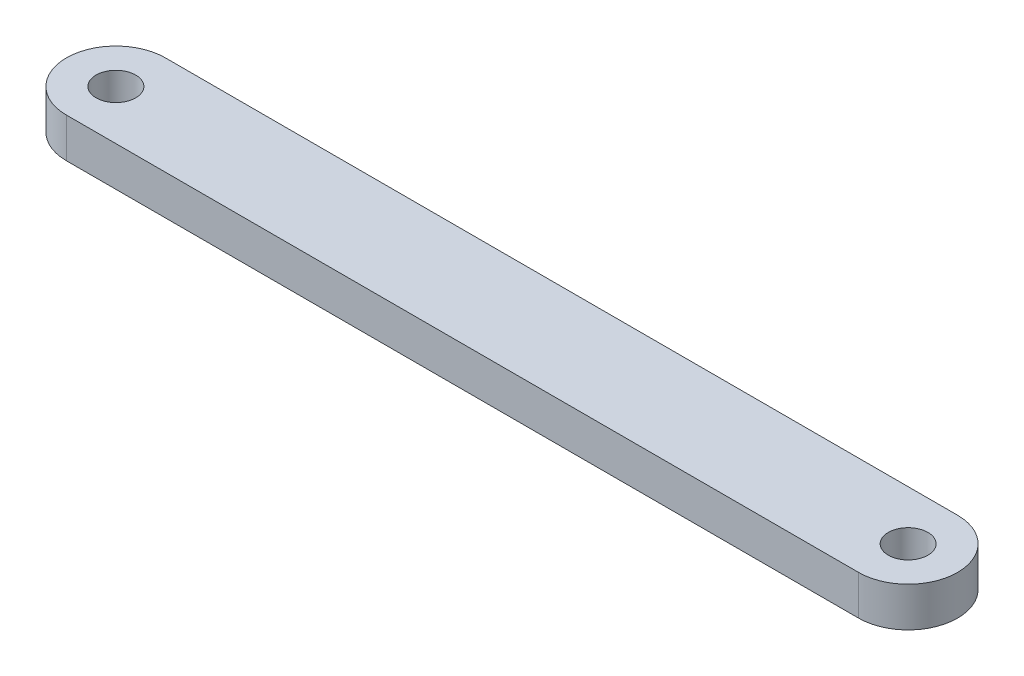
ISO-10303-21;
HEADER;
FILE_DESCRIPTION(('STEP AP214'),'2;1');
FILE_NAME('part.step','',(''),(''),'','','');
FILE_SCHEMA(('AUTOMOTIVE_DESIGN { 1 0 10303 214 1 1 1 1 }'));
ENDSEC;
DATA;
#1=APPLICATION_CONTEXT('core data for automotive mechanical design processes');
#2=APPLICATION_PROTOCOL_DEFINITION('international standard','automotive_design',2000,#1);
#3=PRODUCT_CONTEXT('',#1,'mechanical');
#4=PRODUCT('Part','Part','',(#3));
#5=PRODUCT_RELATED_PRODUCT_CATEGORY('part','',(#4));
#6=PRODUCT_DEFINITION_FORMATION('','',#4);
#7=PRODUCT_DEFINITION_CONTEXT('part definition',#1,'design');
#8=PRODUCT_DEFINITION('design','',#6,#7);
#9=PRODUCT_DEFINITION_SHAPE('','',#8);
#10=(LENGTH_UNIT() NAMED_UNIT(*) SI_UNIT(.MILLI.,.METRE.));
#11=(NAMED_UNIT(*) PLANE_ANGLE_UNIT() SI_UNIT($,.RADIAN.));
#12=(NAMED_UNIT(*) SI_UNIT($,.STERADIAN.) SOLID_ANGLE_UNIT());
#13=UNCERTAINTY_MEASURE_WITH_UNIT(LENGTH_MEASURE(1.E-05),#10,'distance_accuracy_value','');
#14=(GEOMETRIC_REPRESENTATION_CONTEXT(3) GLOBAL_UNCERTAINTY_ASSIGNED_CONTEXT((#13)) GLOBAL_UNIT_ASSIGNED_CONTEXT((#10,
#11,#12)) REPRESENTATION_CONTEXT('',''));
#15=CARTESIAN_POINT('',(0.,0.,0.));
#16=DIRECTION('',(0.,0.,1.));
#17=DIRECTION('',(1.,0.,0.));
#18=AXIS2_PLACEMENT_3D('',#15,#16,#17);
#19=CARTESIAN_POINT('',(-10.,2.,0.));
#20=DIRECTION('',(0.,1.,0.));
#21=DIRECTION('',(0.,0.,1.));
#22=AXIS2_PLACEMENT_3D('',#19,#20,#21);
#23=PLANE('',#22);
#24=CARTESIAN_POINT('',(30.,2.,0.));
#25=DIRECTION('',(0.,1.,0.));
#26=DIRECTION('',(0.,0.,1.));
#27=AXIS2_PLACEMENT_3D('',#24,#25,#26);
#28=CIRCLE('',#27,0.999999999999998);
#29=CARTESIAN_POINT('',(30.,2.,0.999999999999998));
#30=VERTEX_POINT('',#29);
#31=EDGE_CURVE('E104',#30,#30,#28,.T.);
#32=ORIENTED_EDGE('',*,*,#31,.F.);
#33=EDGE_LOOP('',(#32));
#34=FACE_BOUND('',#33,.T.);
#35=CARTESIAN_POINT('',(-10.,2.,0.));
#36=DIRECTION('',(0.,1.,0.));
#37=DIRECTION('',(0.,0.,1.));
#38=AXIS2_PLACEMENT_3D('',#35,#36,#37);
#39=CIRCLE('',#38,2.5);
#40=CARTESIAN_POINT('',(-10.,2.,-2.5));
#41=VERTEX_POINT('',#40);
#42=CARTESIAN_POINT('',(-10.,2.,2.5));
#43=VERTEX_POINT('',#42);
#44=EDGE_CURVE('E89',#41,#43,#39,.T.);
#45=ORIENTED_EDGE('',*,*,#44,.T.);
#46=DIRECTION('',(1.,0.,0.));
#47=VECTOR('',#46,1.);
#48=CARTESIAN_POINT('',(-10.,2.,2.5));
#49=LINE('',#48,#47);
#50=CARTESIAN_POINT('',(30.,2.,2.5));
#51=VERTEX_POINT('',#50);
#52=EDGE_CURVE('E84',#43,#51,#49,.T.);
#53=ORIENTED_EDGE('',*,*,#52,.T.);
#54=CARTESIAN_POINT('',(30.,2.,0.));
#55=DIRECTION('',(0.,1.,0.));
#56=DIRECTION('',(0.,0.,1.));
#57=AXIS2_PLACEMENT_3D('',#54,#55,#56);
#58=CIRCLE('',#57,2.5);
#59=CARTESIAN_POINT('',(30.,2.,-2.5));
#60=VERTEX_POINT('',#59);
#61=EDGE_CURVE('E87',#51,#60,#58,.T.);
#62=ORIENTED_EDGE('',*,*,#61,.T.);
#63=DIRECTION('',(-1.,0.,0.));
#64=VECTOR('',#63,1.);
#65=CARTESIAN_POINT('',(-10.,2.,-2.5));
#66=LINE('',#65,#64);
#67=EDGE_CURVE('E54',#60,#41,#66,.T.);
#68=ORIENTED_EDGE('',*,*,#67,.T.);
#69=EDGE_LOOP('',(#45,#53,#62,#68));
#70=FACE_BOUND('',#69,.T.);
#71=CARTESIAN_POINT('',(-10.,2.,0.));
#72=DIRECTION('',(0.,1.,0.));
#73=DIRECTION('',(0.,0.,1.));
#74=AXIS2_PLACEMENT_3D('',#71,#72,#73);
#75=CIRCLE('',#74,1.);
#76=CARTESIAN_POINT('',(-10.,2.,1.));
#77=VERTEX_POINT('',#76);
#78=EDGE_CURVE('E119',#77,#77,#75,.T.);
#79=ORIENTED_EDGE('',*,*,#78,.F.);
#80=EDGE_LOOP('',(#79));
#81=FACE_BOUND('',#80,.T.);
#82=ADVANCED_FACE('F37',(#34,#70,#81),#23,.T.);
#83=CARTESIAN_POINT('',(-10.,0.,0.));
#84=DIRECTION('',(0.,1.,0.));
#85=DIRECTION('',(0.,0.,1.));
#86=AXIS2_PLACEMENT_3D('',#83,#84,#85);
#87=PLANE('',#86);
#88=CARTESIAN_POINT('',(-10.,0.,0.));
#89=DIRECTION('',(0.,1.,0.));
#90=DIRECTION('',(0.,0.,1.));
#91=AXIS2_PLACEMENT_3D('',#88,#89,#90);
#92=CIRCLE('',#91,2.5);
#93=CARTESIAN_POINT('',(-10.,0.,-2.5));
#94=VERTEX_POINT('',#93);
#95=CARTESIAN_POINT('',(-10.,0.,2.5));
#96=VERTEX_POINT('',#95);
#97=EDGE_CURVE('E101',#94,#96,#92,.T.);
#98=ORIENTED_EDGE('',*,*,#97,.F.);
#99=DIRECTION('',(-1.,0.,0.));
#100=VECTOR('',#99,1.);
#101=CARTESIAN_POINT('',(-10.,0.,-2.5));
#102=LINE('',#101,#100);
#103=CARTESIAN_POINT('',(30.,0.,-2.5));
#104=VERTEX_POINT('',#103);
#105=EDGE_CURVE('E77',#104,#94,#102,.T.);
#106=ORIENTED_EDGE('',*,*,#105,.F.);
#107=CARTESIAN_POINT('',(30.,0.,0.));
#108=DIRECTION('',(0.,1.,0.));
#109=DIRECTION('',(0.,0.,1.));
#110=AXIS2_PLACEMENT_3D('',#107,#108,#109);
#111=CIRCLE('',#110,2.5);
#112=CARTESIAN_POINT('',(30.,0.,2.5));
#113=VERTEX_POINT('',#112);
#114=EDGE_CURVE('E71',#113,#104,#111,.T.);
#115=ORIENTED_EDGE('',*,*,#114,.F.);
#116=DIRECTION('',(1.,0.,0.));
#117=VECTOR('',#116,1.);
#118=CARTESIAN_POINT('',(-10.,0.,2.5));
#119=LINE('',#118,#117);
#120=EDGE_CURVE('E93',#96,#113,#119,.T.);
#121=ORIENTED_EDGE('',*,*,#120,.F.);
#122=EDGE_LOOP('',(#98,#106,#115,#121));
#123=FACE_BOUND('',#122,.T.);
#124=CARTESIAN_POINT('',(30.,0.,0.));
#125=DIRECTION('',(0.,1.,0.));
#126=DIRECTION('',(0.,0.,1.));
#127=AXIS2_PLACEMENT_3D('',#124,#125,#126);
#128=CIRCLE('',#127,0.999999999999998);
#129=CARTESIAN_POINT('',(30.,0.,0.999999999999998));
#130=VERTEX_POINT('',#129);
#131=EDGE_CURVE('E116',#130,#130,#128,.T.);
#132=ORIENTED_EDGE('',*,*,#131,.T.);
#133=EDGE_LOOP('',(#132));
#134=FACE_BOUND('',#133,.T.);
#135=CARTESIAN_POINT('',(-10.,0.,0.));
#136=DIRECTION('',(0.,1.,0.));
#137=DIRECTION('',(0.,0.,1.));
#138=AXIS2_PLACEMENT_3D('',#135,#136,#137);
#139=CIRCLE('',#138,1.);
#140=CARTESIAN_POINT('',(-10.,0.,1.));
#141=VERTEX_POINT('',#140);
#142=EDGE_CURVE('E122',#141,#141,#139,.T.);
#143=ORIENTED_EDGE('',*,*,#142,.T.);
#144=EDGE_LOOP('',(#143));
#145=FACE_BOUND('',#144,.T.);
#146=ADVANCED_FACE('F112',(#123,#134,#145),#87,.F.);
#147=CARTESIAN_POINT('',(-10.,2.,0.));
#148=DIRECTION('',(0.,-1.,0.));
#149=DIRECTION('',(0.,0.,-1.));
#150=AXIS2_PLACEMENT_3D('',#147,#148,#149);
#151=CYLINDRICAL_SURFACE('',#150,2.5);
#152=ORIENTED_EDGE('',*,*,#97,.T.);
#153=DIRECTION('',(0.,-1.,0.));
#154=VECTOR('',#153,1.);
#155=CARTESIAN_POINT('',(-10.,2.,2.5));
#156=LINE('',#155,#154);
#157=EDGE_CURVE('E11',#43,#96,#156,.T.);
#158=ORIENTED_EDGE('',*,*,#157,.F.);
#159=ORIENTED_EDGE('',*,*,#44,.F.);
#160=DIRECTION('',(0.,-1.,0.));
#161=VECTOR('',#160,1.);
#162=CARTESIAN_POINT('',(-10.,2.,-2.5));
#163=LINE('',#162,#161);
#164=EDGE_CURVE('E97',#41,#94,#163,.T.);
#165=ORIENTED_EDGE('',*,*,#164,.T.);
#166=EDGE_LOOP('',(#152,#158,#159,#165));
#167=FACE_BOUND('',#166,.T.);
#168=ADVANCED_FACE('F39',(#167),#151,.T.);
#169=CARTESIAN_POINT('',(-10.,2.,2.5));
#170=DIRECTION('',(0.,0.,-1.));
#171=DIRECTION('',(-1.,0.,0.));
#172=AXIS2_PLACEMENT_3D('',#169,#170,#171);
#173=PLANE('',#172);
#174=ORIENTED_EDGE('',*,*,#120,.T.);
#175=DIRECTION('',(0.,-1.,0.));
#176=VECTOR('',#175,1.);
#177=CARTESIAN_POINT('',(30.,2.,2.5));
#178=LINE('',#177,#176);
#179=EDGE_CURVE('E46',#51,#113,#178,.T.);
#180=ORIENTED_EDGE('',*,*,#179,.F.);
#181=ORIENTED_EDGE('',*,*,#52,.F.);
#182=ORIENTED_EDGE('',*,*,#157,.T.);
#183=EDGE_LOOP('',(#174,#180,#181,#182));
#184=FACE_BOUND('',#183,.T.);
#185=ADVANCED_FACE('F92',(#184),#173,.F.);
#186=CARTESIAN_POINT('',(30.,2.,0.));
#187=DIRECTION('',(0.,-1.,0.));
#188=DIRECTION('',(0.,0.,-1.));
#189=AXIS2_PLACEMENT_3D('',#186,#187,#188);
#190=CYLINDRICAL_SURFACE('',#189,2.5);
#191=ORIENTED_EDGE('',*,*,#114,.T.);
#192=DIRECTION('',(0.,-1.,0.));
#193=VECTOR('',#192,1.);
#194=CARTESIAN_POINT('',(30.,2.,-2.5));
#195=LINE('',#194,#193);
#196=EDGE_CURVE('E94',#60,#104,#195,.T.);
#197=ORIENTED_EDGE('',*,*,#196,.F.);
#198=ORIENTED_EDGE('',*,*,#61,.F.);
#199=ORIENTED_EDGE('',*,*,#179,.T.);
#200=EDGE_LOOP('',(#191,#197,#198,#199));
#201=FACE_BOUND('',#200,.T.);
#202=ADVANCED_FACE('F95',(#201),#190,.T.);
#203=CARTESIAN_POINT('',(-10.,2.,-2.5));
#204=DIRECTION('',(0.,0.,1.));
#205=DIRECTION('',(1.,0.,0.));
#206=AXIS2_PLACEMENT_3D('',#203,#204,#205);
#207=PLANE('',#206);
#208=ORIENTED_EDGE('',*,*,#105,.T.);
#209=ORIENTED_EDGE('',*,*,#164,.F.);
#210=ORIENTED_EDGE('',*,*,#67,.F.);
#211=ORIENTED_EDGE('',*,*,#196,.T.);
#212=EDGE_LOOP('',(#208,#209,#210,#211));
#213=FACE_BOUND('',#212,.T.);
#214=ADVANCED_FACE('F109',(#213),#207,.F.);
#215=CARTESIAN_POINT('',(30.,2.,0.));
#216=DIRECTION('',(0.,-1.,0.));
#217=DIRECTION('',(0.,0.,-1.));
#218=AXIS2_PLACEMENT_3D('',#215,#216,#217);
#219=CYLINDRICAL_SURFACE('',#218,0.999999999999998);
#220=ORIENTED_EDGE('',*,*,#31,.T.);
#221=EDGE_LOOP('',(#220));
#222=FACE_BOUND('',#221,.T.);
#223=ORIENTED_EDGE('',*,*,#131,.F.);
#224=EDGE_LOOP('',(#223));
#225=FACE_BOUND('',#224,.T.);
#226=ADVANCED_FACE('F139',(#222,#225),#219,.F.);
#227=CARTESIAN_POINT('',(-10.,2.,0.));
#228=DIRECTION('',(0.,-1.,0.));
#229=DIRECTION('',(0.,0.,-1.));
#230=AXIS2_PLACEMENT_3D('',#227,#228,#229);
#231=CYLINDRICAL_SURFACE('',#230,1.);
#232=ORIENTED_EDGE('',*,*,#78,.T.);
#233=EDGE_LOOP('',(#232));
#234=FACE_BOUND('',#233,.T.);
#235=ORIENTED_EDGE('',*,*,#142,.F.);
#236=EDGE_LOOP('',(#235));
#237=FACE_BOUND('',#236,.T.);
#238=ADVANCED_FACE('F128',(#234,#237),#231,.F.);
#239=CLOSED_SHELL('',(#82,#146,#168,#185,#202,#214,#226,#238));
#240=MANIFOLD_SOLID_BREP('B2',#239);
#241=ADVANCED_BREP_SHAPE_REPRESENTATION('',(#18,#240),#14);
#242=SHAPE_DEFINITION_REPRESENTATION(#9,#241);
ENDSEC;
END-ISO-10303-21;
